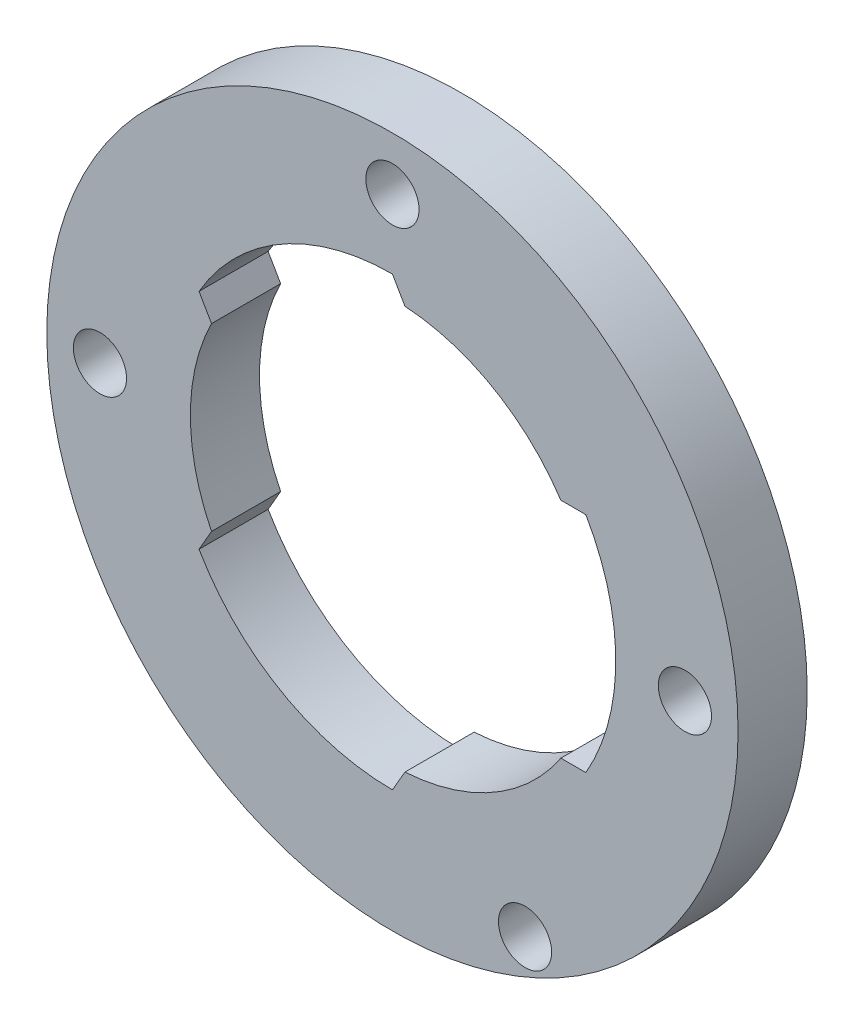
ISO-10303-21;
HEADER;
FILE_DESCRIPTION(('STEP AP214'),'2;1');
FILE_NAME('part.step','',(''),(''),'','','');
FILE_SCHEMA(('AUTOMOTIVE_DESIGN { 1 0 10303 214 1 1 1 1 }'));
ENDSEC;
DATA;
#1=APPLICATION_CONTEXT('core data for automotive mechanical design processes');
#2=APPLICATION_PROTOCOL_DEFINITION('international standard','automotive_design',2000,#1);
#3=PRODUCT_CONTEXT('',#1,'mechanical');
#4=PRODUCT('Part','Part','',(#3));
#5=PRODUCT_RELATED_PRODUCT_CATEGORY('part','',(#4));
#6=PRODUCT_DEFINITION_FORMATION('','',#4);
#7=PRODUCT_DEFINITION_CONTEXT('part definition',#1,'design');
#8=PRODUCT_DEFINITION('design','',#6,#7);
#9=PRODUCT_DEFINITION_SHAPE('','',#8);
#10=(LENGTH_UNIT() NAMED_UNIT(*) SI_UNIT(.MILLI.,.METRE.));
#11=(NAMED_UNIT(*) PLANE_ANGLE_UNIT() SI_UNIT($,.RADIAN.));
#12=(NAMED_UNIT(*) SI_UNIT($,.STERADIAN.) SOLID_ANGLE_UNIT());
#13=UNCERTAINTY_MEASURE_WITH_UNIT(LENGTH_MEASURE(1.E-05),#10,'distance_accuracy_value','');
#14=(GEOMETRIC_REPRESENTATION_CONTEXT(3) GLOBAL_UNCERTAINTY_ASSIGNED_CONTEXT((#13)) GLOBAL_UNIT_ASSIGNED_CONTEXT((#10,
#11,#12)) REPRESENTATION_CONTEXT('',''));
#15=CARTESIAN_POINT('',(0.,0.,0.));
#16=DIRECTION('',(0.,0.,1.));
#17=DIRECTION('',(1.,0.,0.));
#18=AXIS2_PLACEMENT_3D('',#15,#16,#17);
#19=CARTESIAN_POINT('',(-34.925,1.15524367340063E-13,4.1275));
#20=DIRECTION('',(0.,0.,1.));
#21=DIRECTION('',(1.,0.,0.));
#22=AXIS2_PLACEMENT_3D('',#19,#20,#21);
#23=CYLINDRICAL_SURFACE('',#22,1.7);
#24=CARTESIAN_POINT('',(-34.925,1.15524367340063E-13,-4.1275));
#25=DIRECTION('',(0.,0.,1.));
#26=DIRECTION('',(1.,0.,0.));
#27=AXIS2_PLACEMENT_3D('',#24,#25,#26);
#28=CIRCLE('',#27,1.7);
#29=CARTESIAN_POINT('',(-33.225,1.15524367340063E-13,-4.1275));
#30=VERTEX_POINT('',#29);
#31=EDGE_CURVE('E204',#30,#30,#28,.T.);
#32=ORIENTED_EDGE('',*,*,#31,.F.);
#33=EDGE_LOOP('',(#32));
#34=FACE_BOUND('',#33,.T.);
#35=CARTESIAN_POINT('',(-34.925,1.15524367340063E-13,-1.872499906));
#36=DIRECTION('',(0.,0.,1.));
#37=DIRECTION('',(1.,0.,0.));
#38=AXIS2_PLACEMENT_3D('',#35,#36,#37);
#39=CIRCLE('',#38,1.7);
#40=CARTESIAN_POINT('',(-33.225,1.15524367340063E-13,-1.872499906));
#41=VERTEX_POINT('',#40);
#42=EDGE_CURVE('E39',#41,#41,#39,.F.);
#43=ORIENTED_EDGE('',*,*,#42,.F.);
#44=EDGE_LOOP('',(#43));
#45=FACE_BOUND('',#44,.T.);
#46=ADVANCED_FACE('F35',(#34,#45),#23,.F.);
#47=CARTESIAN_POINT('',(34.925,-1.28355604178129E-13,4.1275));
#48=DIRECTION('',(0.,0.,1.));
#49=DIRECTION('',(1.,0.,0.));
#50=AXIS2_PLACEMENT_3D('',#47,#48,#49);
#51=CYLINDRICAL_SURFACE('',#50,1.7);
#52=CARTESIAN_POINT('',(34.925,-1.28355604178129E-13,-4.1275));
#53=DIRECTION('',(0.,0.,1.));
#54=DIRECTION('',(1.,0.,0.));
#55=AXIS2_PLACEMENT_3D('',#52,#53,#54);
#56=CIRCLE('',#55,1.7);
#57=CARTESIAN_POINT('',(36.625,-1.28355604178129E-13,-4.1275));
#58=VERTEX_POINT('',#57);
#59=EDGE_CURVE('E201',#58,#58,#56,.T.);
#60=ORIENTED_EDGE('',*,*,#59,.F.);
#61=EDGE_LOOP('',(#60));
#62=FACE_BOUND('',#61,.T.);
#63=CARTESIAN_POINT('',(34.925,-1.28355604178129E-13,-1.872499906));
#64=DIRECTION('',(0.,0.,1.));
#65=DIRECTION('',(1.,0.,0.));
#66=AXIS2_PLACEMENT_3D('',#63,#64,#65);
#67=CIRCLE('',#66,1.7);
#68=CARTESIAN_POINT('',(36.625,-1.28355604178129E-13,-1.872499906));
#69=VERTEX_POINT('',#68);
#70=EDGE_CURVE('E238',#69,#69,#67,.F.);
#71=ORIENTED_EDGE('',*,*,#70,.F.);
#72=EDGE_LOOP('',(#71));
#73=FACE_BOUND('',#72,.T.);
#74=ADVANCED_FACE('F277',(#62,#73),#51,.F.);
#75=CARTESIAN_POINT('',(1.21939985759096E-13,34.925,4.1275));
#76=DIRECTION('',(0.,0.,1.));
#77=DIRECTION('',(1.,0.,0.));
#78=AXIS2_PLACEMENT_3D('',#75,#76,#77);
#79=CYLINDRICAL_SURFACE('',#78,1.7);
#80=CARTESIAN_POINT('',(1.21939985759096E-13,34.925,-4.1275));
#81=DIRECTION('',(0.,0.,1.));
#82=DIRECTION('',(1.,0.,0.));
#83=AXIS2_PLACEMENT_3D('',#80,#81,#82);
#84=CIRCLE('',#83,1.7);
#85=CARTESIAN_POINT('',(1.70000000000012,34.925,-4.1275));
#86=VERTEX_POINT('',#85);
#87=EDGE_CURVE('E196',#86,#86,#84,.T.);
#88=ORIENTED_EDGE('',*,*,#87,.F.);
#89=EDGE_LOOP('',(#88));
#90=FACE_BOUND('',#89,.T.);
#91=CARTESIAN_POINT('',(1.21939985759096E-13,34.925,-1.872499906));
#92=DIRECTION('',(0.,0.,1.));
#93=DIRECTION('',(1.,0.,0.));
#94=AXIS2_PLACEMENT_3D('',#91,#92,#93);
#95=CIRCLE('',#94,1.7);
#96=CARTESIAN_POINT('',(1.70000000000012,34.925,-1.872499906));
#97=VERTEX_POINT('',#96);
#98=EDGE_CURVE('E235',#97,#97,#95,.F.);
#99=ORIENTED_EDGE('',*,*,#98,.F.);
#100=EDGE_LOOP('',(#99));
#101=FACE_BOUND('',#100,.T.);
#102=ADVANCED_FACE('F255',(#90,#101),#79,.F.);
#103=CARTESIAN_POINT('',(15.8333931761151,-33.9548212413282,4.1275));
#104=DIRECTION('',(0.,0.,1.));
#105=DIRECTION('',(1.,0.,0.));
#106=AXIS2_PLACEMENT_3D('',#103,#104,#105);
#107=CYLINDRICAL_SURFACE('',#106,1.7);
#108=CARTESIAN_POINT('',(15.8333931761151,-33.9548212413282,-4.1275));
#109=DIRECTION('',(0.,0.,1.));
#110=DIRECTION('',(1.,0.,0.));
#111=AXIS2_PLACEMENT_3D('',#108,#109,#110);
#112=CIRCLE('',#111,1.7);
#113=CARTESIAN_POINT('',(17.5333931761151,-33.9548212413282,-4.1275));
#114=VERTEX_POINT('',#113);
#115=EDGE_CURVE('E152',#114,#114,#112,.T.);
#116=ORIENTED_EDGE('',*,*,#115,.F.);
#117=EDGE_LOOP('',(#116));
#118=FACE_BOUND('',#117,.T.);
#119=CARTESIAN_POINT('',(15.8333931761151,-33.9548212413282,-1.872499906));
#120=DIRECTION('',(0.,0.,1.));
#121=DIRECTION('',(1.,0.,0.));
#122=AXIS2_PLACEMENT_3D('',#119,#120,#121);
#123=CIRCLE('',#122,1.7);
#124=CARTESIAN_POINT('',(17.5333931761151,-33.9548212413282,-1.872499906));
#125=VERTEX_POINT('',#124);
#126=EDGE_CURVE('E232',#125,#125,#123,.F.);
#127=ORIENTED_EDGE('',*,*,#126,.F.);
#128=EDGE_LOOP('',(#127));
#129=FACE_BOUND('',#128,.T.);
#130=ADVANCED_FACE('F251',(#118,#129),#107,.F.);
#131=CARTESIAN_POINT('',(0.,0.,4.1275));
#132=DIRECTION('',(0.,0.,-1.));
#133=DIRECTION('',(-1.,0.,0.));
#134=AXIS2_PLACEMENT_3D('',#131,#132,#133);
#135=CYLINDRICAL_SURFACE('',#134,24.13);
#136=DIRECTION('',(0.,0.,-1.));
#137=VECTOR('',#136,1.);
#138=CARTESIAN_POINT('',(1.49316811942358,24.0837569529161,4.1275));
#139=LINE('',#138,#137);
#140=CARTESIAN_POINT('',(1.49316811942358,24.0837569529161,-4.1275));
#141=VERTEX_POINT('',#140);
#142=CARTESIAN_POINT('',(1.49316811942358,24.0837569529161,4.1275));
#143=VERTEX_POINT('',#142);
#144=EDGE_CURVE('E11',#141,#143,#139,.F.);
#145=ORIENTED_EDGE('',*,*,#144,.F.);
#146=CARTESIAN_POINT('',(0.,0.,-4.1275));
#147=DIRECTION('',(0.,0.,1.));
#148=DIRECTION('',(1.,0.,0.));
#149=AXIS2_PLACEMENT_3D('',#146,#147,#148);
#150=CIRCLE('',#149,24.13);
#151=CARTESIAN_POINT('',(20.1105612800836,13.335,-4.1275));
#152=VERTEX_POINT('',#151);
#153=EDGE_CURVE('E213',#152,#141,#150,.T.);
#154=ORIENTED_EDGE('',*,*,#153,.F.);
#155=DIRECTION('',(0.,0.,-1.));
#156=VECTOR('',#155,1.);
#157=CARTESIAN_POINT('',(20.1105612800836,13.335,4.1275));
#158=LINE('',#157,#156);
#159=CARTESIAN_POINT('',(20.1105612800836,13.335,4.1275));
#160=VERTEX_POINT('',#159);
#161=EDGE_CURVE('E220',#160,#152,#158,.T.);
#162=ORIENTED_EDGE('',*,*,#161,.F.);
#163=CARTESIAN_POINT('',(0.,0.,4.1275));
#164=DIRECTION('',(0.,0.,1.));
#165=DIRECTION('',(1.,0.,0.));
#166=AXIS2_PLACEMENT_3D('',#163,#164,#165);
#167=CIRCLE('',#166,24.13);
#168=EDGE_CURVE('E208',#160,#143,#167,.T.);
#169=ORIENTED_EDGE('',*,*,#168,.T.);
#170=EDGE_LOOP('',(#145,#154,#162,#169));
#171=FACE_BOUND('',#170,.T.);
#172=ADVANCED_FACE('F254',(#171),#135,.F.);
#173=DIRECTION('',(0.,0.,-1.));
#174=VECTOR('',#173,1.);
#175=CARTESIAN_POINT('',(-21.6037293995074,10.748756952916,4.1275));
#176=LINE('',#175,#174);
#177=CARTESIAN_POINT('',(-21.6037293995074,10.748756952916,4.1275));
#178=VERTEX_POINT('',#177);
#179=CARTESIAN_POINT('',(-21.6037293995074,10.748756952916,-4.1275));
#180=VERTEX_POINT('',#179);
#181=EDGE_CURVE('E44',#178,#180,#176,.T.);
#182=ORIENTED_EDGE('',*,*,#181,.F.);
#183=CARTESIAN_POINT('',(-21.6037293995072,-10.7487569529163,4.1275));
#184=VERTEX_POINT('',#183);
#185=EDGE_CURVE('E212',#178,#184,#167,.T.);
#186=ORIENTED_EDGE('',*,*,#185,.T.);
#187=DIRECTION('',(0.,0.,-1.));
#188=VECTOR('',#187,1.);
#189=CARTESIAN_POINT('',(-21.6037293995072,-10.7487569529163,4.1275));
#190=LINE('',#189,#188);
#191=CARTESIAN_POINT('',(-21.6037293995072,-10.7487569529163,-4.1275));
#192=VERTEX_POINT('',#191);
#193=EDGE_CURVE('E229',#192,#184,#190,.F.);
#194=ORIENTED_EDGE('',*,*,#193,.F.);
#195=EDGE_CURVE('E216',#180,#192,#150,.T.);
#196=ORIENTED_EDGE('',*,*,#195,.F.);
#197=EDGE_LOOP('',(#182,#186,#194,#196));
#198=FACE_BOUND('',#197,.T.);
#199=ADVANCED_FACE('F294',(#198),#135,.F.);
#200=CARTESIAN_POINT('',(0.,0.,4.1275));
#201=DIRECTION('',(0.,0.,1.));
#202=DIRECTION('',(1.,0.,0.));
#203=AXIS2_PLACEMENT_3D('',#200,#201,#202);
#204=PLANE('',#203);
#205=CARTESIAN_POINT('',(1.21939985759096E-13,34.925,4.1275));
#206=DIRECTION('',(0.,0.,1.));
#207=DIRECTION('',(1.,0.,0.));
#208=AXIS2_PLACEMENT_3D('',#205,#206,#207);
#209=CIRCLE('',#208,3.175);
#210=CARTESIAN_POINT('',(3.17500000000012,34.925,4.1275));
#211=VERTEX_POINT('',#210);
#212=EDGE_CURVE('E403',#211,#211,#209,.T.);
#213=ORIENTED_EDGE('',*,*,#212,.F.);
#214=EDGE_LOOP('',(#213));
#215=FACE_BOUND('',#214,.T.);
#216=CARTESIAN_POINT('',(34.925,-1.28355604178129E-13,4.1275));
#217=DIRECTION('',(0.,0.,1.));
#218=DIRECTION('',(1.,0.,0.));
#219=AXIS2_PLACEMENT_3D('',#216,#217,#218);
#220=CIRCLE('',#219,3.175);
#221=CARTESIAN_POINT('',(38.1,-1.28355604178129E-13,4.1275));
#222=VERTEX_POINT('',#221);
#223=EDGE_CURVE('E399',#222,#222,#220,.T.);
#224=ORIENTED_EDGE('',*,*,#223,.F.);
#225=EDGE_LOOP('',(#224));
#226=FACE_BOUND('',#225,.T.);
#227=CARTESIAN_POINT('',(15.8333931761151,-33.9548212413282,4.1275));
#228=DIRECTION('',(0.,0.,1.));
#229=DIRECTION('',(1.,0.,0.));
#230=AXIS2_PLACEMENT_3D('',#227,#228,#229);
#231=CIRCLE('',#230,3.175);
#232=CARTESIAN_POINT('',(19.0083931761151,-33.9548212413282,4.1275));
#233=VERTEX_POINT('',#232);
#234=EDGE_CURVE('E405',#233,#233,#231,.T.);
#235=ORIENTED_EDGE('',*,*,#234,.F.);
#236=EDGE_LOOP('',(#235));
#237=FACE_BOUND('',#236,.T.);
#238=CARTESIAN_POINT('',(-34.925,1.15524367340063E-13,4.1275));
#239=DIRECTION('',(0.,0.,1.));
#240=DIRECTION('',(1.,0.,0.));
#241=AXIS2_PLACEMENT_3D('',#238,#239,#240);
#242=CIRCLE('',#241,3.175);
#243=CARTESIAN_POINT('',(-31.75,1.15524367340063E-13,4.1275));
#244=VERTEX_POINT('',#243);
#245=EDGE_CURVE('E413',#244,#244,#242,.T.);
#246=ORIENTED_EDGE('',*,*,#245,.F.);
#247=EDGE_LOOP('',(#246));
#248=FACE_BOUND('',#247,.T.);
#249=DIRECTION('',(0.500000000000004,-0.866025403784437,0.));
#250=VECTOR('',#249,1.);
#251=CARTESIAN_POINT('',(11.5484487594655,6.66750000000006,4.1275));
#252=LINE('',#251,#250);
#253=CARTESIAN_POINT('',(-1.05818132034585E-13,26.67,4.1275));
#254=VERTEX_POINT('',#253);
#255=EDGE_CURVE('E165',#254,#143,#252,.T.);
#256=ORIENTED_EDGE('',*,*,#255,.T.);
#257=ORIENTED_EDGE('',*,*,#168,.F.);
#258=DIRECTION('',(1.,0.,0.));
#259=VECTOR('',#258,1.);
#260=CARTESIAN_POINT('',(23.096897518931,13.335,4.1275));
#261=LINE('',#260,#259);
#262=CARTESIAN_POINT('',(23.096897518931,13.335,4.1275));
#263=VERTEX_POINT('',#262);
#264=EDGE_CURVE('E178',#160,#263,#261,.T.);
#265=ORIENTED_EDGE('',*,*,#264,.T.);
#266=CARTESIAN_POINT('',(0.,0.,4.1275));
#267=DIRECTION('',(0.,0.,-1.));
#268=DIRECTION('',(-1.,0.,0.));
#269=AXIS2_PLACEMENT_3D('',#266,#267,#268);
#270=CIRCLE('',#269,26.67);
#271=CARTESIAN_POINT('',(23.096897518931,-13.335,4.1275));
#272=VERTEX_POINT('',#271);
#273=EDGE_CURVE('E181',#263,#272,#270,.T.);
#274=ORIENTED_EDGE('',*,*,#273,.T.);
#275=DIRECTION('',(-1.,0.,0.));
#276=VECTOR('',#275,1.);
#277=CARTESIAN_POINT('',(0.,-13.335,4.1275));
#278=LINE('',#277,#276);
#279=CARTESIAN_POINT('',(20.1105612800836,-13.335,4.1275));
#280=VERTEX_POINT('',#279);
#281=EDGE_CURVE('E185',#272,#280,#278,.T.);
#282=ORIENTED_EDGE('',*,*,#281,.T.);
#283=CARTESIAN_POINT('',(1.49316811942391,-24.0837569529161,4.1275));
#284=VERTEX_POINT('',#283);
#285=EDGE_CURVE('E146',#284,#280,#167,.T.);
#286=ORIENTED_EDGE('',*,*,#285,.F.);
#287=DIRECTION('',(-0.499999999999992,-0.866025403784443,0.));
#288=VECTOR('',#287,1.);
#289=CARTESIAN_POINT('',(2.67147415300428E-13,-26.67,4.1275));
#290=LINE('',#289,#288);
#291=CARTESIAN_POINT('',(2.67147415300428E-13,-26.67,4.1275));
#292=VERTEX_POINT('',#291);
#293=EDGE_CURVE('E52',#284,#292,#290,.T.);
#294=ORIENTED_EDGE('',*,*,#293,.T.);
#295=CARTESIAN_POINT('',(0.,0.,4.1275));
#296=DIRECTION('',(0.,0.,-1.));
#297=DIRECTION('',(0.499999999999992,0.866025403784443,0.));
#298=AXIS2_PLACEMENT_3D('',#295,#296,#297);
#299=CIRCLE('',#298,26.67);
#300=CARTESIAN_POINT('',(-23.0968975189309,-13.3350000000002,4.1275));
#301=VERTEX_POINT('',#300);
#302=EDGE_CURVE('E135',#292,#301,#299,.T.);
#303=ORIENTED_EDGE('',*,*,#302,.T.);
#304=DIRECTION('',(0.499999999999992,0.866025403784443,0.));
#305=VECTOR('',#304,1.);
#306=CARTESIAN_POINT('',(-11.5484487594656,6.6674999999999,4.1275));
#307=LINE('',#306,#305);
#308=EDGE_CURVE('E132',#301,#184,#307,.T.);
#309=ORIENTED_EDGE('',*,*,#308,.T.);
#310=ORIENTED_EDGE('',*,*,#185,.F.);
#311=DIRECTION('',(-0.500000000000004,0.866025403784436,0.));
#312=VECTOR('',#311,1.);
#313=CARTESIAN_POINT('',(-23.0968975189311,13.3349999999999,4.1275));
#314=LINE('',#313,#312);
#315=CARTESIAN_POINT('',(-23.0968975189311,13.3349999999999,4.1275));
#316=VERTEX_POINT('',#315);
#317=EDGE_CURVE('E60',#178,#316,#314,.T.);
#318=ORIENTED_EDGE('',*,*,#317,.T.);
#319=CARTESIAN_POINT('',(0.,0.,4.1275));
#320=DIRECTION('',(0.,0.,-1.));
#321=DIRECTION('',(0.500000000000004,-0.866025403784436,0.));
#322=AXIS2_PLACEMENT_3D('',#319,#320,#321);
#323=CIRCLE('',#322,26.67);
#324=EDGE_CURVE('E161',#316,#254,#323,.T.);
#325=ORIENTED_EDGE('',*,*,#324,.T.);
#326=EDGE_LOOP('',(#256,#257,#265,#274,#282,#286,#294,#303,#309,#310,#318,#325));
#327=FACE_BOUND('',#326,.T.);
#328=CARTESIAN_POINT('',(0.,0.,4.1275));
#329=DIRECTION('',(0.,0.,1.));
#330=DIRECTION('',(1.,0.,0.));
#331=AXIS2_PLACEMENT_3D('',#328,#329,#330);
#332=CIRCLE('',#331,41.275);
#333=CARTESIAN_POINT('',(41.275,0.,4.1275));
#334=VERTEX_POINT('',#333);
#335=EDGE_CURVE('E217',#334,#334,#332,.T.);
#336=ORIENTED_EDGE('',*,*,#335,.T.);
#337=EDGE_LOOP('',(#336));
#338=FACE_BOUND('',#337,.T.);
#339=ADVANCED_FACE('F143',(#215,#226,#237,#248,#327,#338),#204,.T.);
#340=CARTESIAN_POINT('',(0.,0.,-4.1275));
#341=DIRECTION('',(0.,0.,1.));
#342=DIRECTION('',(1.,0.,0.));
#343=AXIS2_PLACEMENT_3D('',#340,#341,#342);
#344=PLANE('',#343);
#345=ORIENTED_EDGE('',*,*,#115,.T.);
#346=EDGE_LOOP('',(#345));
#347=FACE_BOUND('',#346,.T.);
#348=ORIENTED_EDGE('',*,*,#87,.T.);
#349=EDGE_LOOP('',(#348));
#350=FACE_BOUND('',#349,.T.);
#351=ORIENTED_EDGE('',*,*,#59,.T.);
#352=EDGE_LOOP('',(#351));
#353=FACE_BOUND('',#352,.T.);
#354=ORIENTED_EDGE('',*,*,#31,.T.);
#355=EDGE_LOOP('',(#354));
#356=FACE_BOUND('',#355,.T.);
#357=CARTESIAN_POINT('',(0.,0.,-4.1275));
#358=DIRECTION('',(0.,0.,1.));
#359=DIRECTION('',(1.,0.,0.));
#360=AXIS2_PLACEMENT_3D('',#357,#358,#359);
#361=CIRCLE('',#360,41.275);
#362=CARTESIAN_POINT('',(41.275,0.,-4.1275));
#363=VERTEX_POINT('',#362);
#364=EDGE_CURVE('E211',#363,#363,#361,.T.);
#365=ORIENTED_EDGE('',*,*,#364,.F.);
#366=EDGE_LOOP('',(#365));
#367=FACE_BOUND('',#366,.T.);
#368=ORIENTED_EDGE('',*,*,#153,.T.);
#369=DIRECTION('',(0.500000000000004,-0.866025403784437,0.));
#370=VECTOR('',#369,1.);
#371=CARTESIAN_POINT('',(11.5484487594655,6.66750000000006,-4.1275));
#372=LINE('',#371,#370);
#373=CARTESIAN_POINT('',(-1.05818132034585E-13,26.67,-4.1275));
#374=VERTEX_POINT('',#373);
#375=EDGE_CURVE('E162',#374,#141,#372,.T.);
#376=ORIENTED_EDGE('',*,*,#375,.F.);
#377=CARTESIAN_POINT('',(0.,0.,-4.1275));
#378=DIRECTION('',(0.,0.,-1.));
#379=DIRECTION('',(0.500000000000004,-0.866025403784436,0.));
#380=AXIS2_PLACEMENT_3D('',#377,#378,#379);
#381=CIRCLE('',#380,26.67);
#382=CARTESIAN_POINT('',(-23.0968975189311,13.3349999999999,-4.1275));
#383=VERTEX_POINT('',#382);
#384=EDGE_CURVE('E169',#383,#374,#381,.T.);
#385=ORIENTED_EDGE('',*,*,#384,.F.);
#386=DIRECTION('',(-0.500000000000004,0.866025403784436,0.));
#387=VECTOR('',#386,1.);
#388=CARTESIAN_POINT('',(-23.0968975189311,13.3349999999999,-4.1275));
#389=LINE('',#388,#387);
#390=EDGE_CURVE('E158',#180,#383,#389,.T.);
#391=ORIENTED_EDGE('',*,*,#390,.F.);
#392=ORIENTED_EDGE('',*,*,#195,.T.);
#393=DIRECTION('',(0.499999999999992,0.866025403784443,0.));
#394=VECTOR('',#393,1.);
#395=CARTESIAN_POINT('',(-11.5484487594656,6.6674999999999,-4.1275));
#396=LINE('',#395,#394);
#397=CARTESIAN_POINT('',(-23.0968975189309,-13.3350000000002,-4.1275));
#398=VERTEX_POINT('',#397);
#399=EDGE_CURVE('E147',#398,#192,#396,.T.);
#400=ORIENTED_EDGE('',*,*,#399,.F.);
#401=CARTESIAN_POINT('',(0.,0.,-4.1275));
#402=DIRECTION('',(0.,0.,-1.));
#403=DIRECTION('',(0.499999999999992,0.866025403784443,0.));
#404=AXIS2_PLACEMENT_3D('',#401,#402,#403);
#405=CIRCLE('',#404,26.67);
#406=CARTESIAN_POINT('',(2.67147415300428E-13,-26.67,-4.1275));
#407=VERTEX_POINT('',#406);
#408=EDGE_CURVE('E149',#407,#398,#405,.T.);
#409=ORIENTED_EDGE('',*,*,#408,.F.);
#410=DIRECTION('',(-0.499999999999992,-0.866025403784443,0.));
#411=VECTOR('',#410,1.);
#412=CARTESIAN_POINT('',(2.67147415300428E-13,-26.67,-4.1275));
#413=LINE('',#412,#411);
#414=CARTESIAN_POINT('',(1.49316811942391,-24.0837569529161,-4.1275));
#415=VERTEX_POINT('',#414);
#416=EDGE_CURVE('E127',#415,#407,#413,.T.);
#417=ORIENTED_EDGE('',*,*,#416,.F.);
#418=CARTESIAN_POINT('',(20.1105612800836,-13.335,-4.1275));
#419=VERTEX_POINT('',#418);
#420=EDGE_CURVE('E207',#415,#419,#150,.T.);
#421=ORIENTED_EDGE('',*,*,#420,.T.);
#422=DIRECTION('',(-1.,0.,0.));
#423=VECTOR('',#422,1.);
#424=CARTESIAN_POINT('',(0.,-13.335,-4.1275));
#425=LINE('',#424,#423);
#426=CARTESIAN_POINT('',(23.096897518931,-13.335,-4.1275));
#427=VERTEX_POINT('',#426);
#428=EDGE_CURVE('E182',#427,#419,#425,.T.);
#429=ORIENTED_EDGE('',*,*,#428,.F.);
#430=CARTESIAN_POINT('',(0.,0.,-4.1275));
#431=DIRECTION('',(0.,0.,-1.));
#432=DIRECTION('',(-1.,0.,0.));
#433=AXIS2_PLACEMENT_3D('',#430,#431,#432);
#434=CIRCLE('',#433,26.67);
#435=CARTESIAN_POINT('',(23.096897518931,13.335,-4.1275));
#436=VERTEX_POINT('',#435);
#437=EDGE_CURVE('E189',#436,#427,#434,.T.);
#438=ORIENTED_EDGE('',*,*,#437,.F.);
#439=DIRECTION('',(1.,0.,0.));
#440=VECTOR('',#439,1.);
#441=CARTESIAN_POINT('',(23.096897518931,13.335,-4.1275));
#442=LINE('',#441,#440);
#443=EDGE_CURVE('E175',#152,#436,#442,.T.);
#444=ORIENTED_EDGE('',*,*,#443,.F.);
#445=EDGE_LOOP('',(#368,#376,#385,#391,#392,#400,#409,#417,#421,#429,#438,#444));
#446=FACE_BOUND('',#445,.T.);
#447=ADVANCED_FACE('F248',(#347,#350,#353,#356,#367,#446),#344,.F.);
#448=CARTESIAN_POINT('',(0.,0.,4.1275));
#449=DIRECTION('',(0.,0.,-1.));
#450=DIRECTION('',(-1.,0.,0.));
#451=AXIS2_PLACEMENT_3D('',#448,#449,#450);
#452=CYLINDRICAL_SURFACE('',#451,41.275);
#453=ORIENTED_EDGE('',*,*,#335,.F.);
#454=EDGE_LOOP('',(#453));
#455=FACE_BOUND('',#454,.T.);
#456=ORIENTED_EDGE('',*,*,#364,.T.);
#457=EDGE_LOOP('',(#456));
#458=FACE_BOUND('',#457,.T.);
#459=ADVANCED_FACE('F37',(#455,#458),#452,.T.);
#460=DIRECTION('',(0.,0.,-1.));
#461=VECTOR('',#460,1.);
#462=CARTESIAN_POINT('',(1.49316811942391,-24.0837569529161,4.1275));
#463=LINE('',#462,#461);
#464=EDGE_CURVE('E227',#284,#415,#463,.T.);
#465=ORIENTED_EDGE('',*,*,#464,.F.);
#466=ORIENTED_EDGE('',*,*,#285,.T.);
#467=DIRECTION('',(0.,0.,-1.));
#468=VECTOR('',#467,1.);
#469=CARTESIAN_POINT('',(20.1105612800836,-13.335,4.1275));
#470=LINE('',#469,#468);
#471=EDGE_CURVE('E224',#419,#280,#470,.F.);
#472=ORIENTED_EDGE('',*,*,#471,.F.);
#473=ORIENTED_EDGE('',*,*,#420,.F.);
#474=EDGE_LOOP('',(#465,#466,#472,#473));
#475=FACE_BOUND('',#474,.T.);
#476=ADVANCED_FACE('F289',(#475),#135,.F.);
#477=CARTESIAN_POINT('',(0.,-13.335,4.1275));
#478=DIRECTION('',(0.,-1.,0.));
#479=DIRECTION('',(1.,0.,0.));
#480=AXIS2_PLACEMENT_3D('',#477,#478,#479);
#481=PLANE('',#480);
#482=ORIENTED_EDGE('',*,*,#471,.T.);
#483=ORIENTED_EDGE('',*,*,#281,.F.);
#484=DIRECTION('',(0.,0.,-1.));
#485=VECTOR('',#484,1.);
#486=CARTESIAN_POINT('',(23.096897518931,-13.335,4.1275));
#487=LINE('',#486,#485);
#488=EDGE_CURVE('E194',#272,#427,#487,.T.);
#489=ORIENTED_EDGE('',*,*,#488,.T.);
#490=ORIENTED_EDGE('',*,*,#428,.T.);
#491=EDGE_LOOP('',(#482,#483,#489,#490));
#492=FACE_BOUND('',#491,.T.);
#493=ADVANCED_FACE('F292',(#492),#481,.F.);
#494=CARTESIAN_POINT('',(0.,0.,4.1275));
#495=DIRECTION('',(0.,0.,-1.));
#496=DIRECTION('',(-1.,0.,0.));
#497=AXIS2_PLACEMENT_3D('',#494,#495,#496);
#498=CYLINDRICAL_SURFACE('',#497,26.67);
#499=ORIENTED_EDGE('',*,*,#437,.T.);
#500=ORIENTED_EDGE('',*,*,#488,.F.);
#501=ORIENTED_EDGE('',*,*,#273,.F.);
#502=DIRECTION('',(0.,0.,-1.));
#503=VECTOR('',#502,1.);
#504=CARTESIAN_POINT('',(23.096897518931,13.335,4.1275));
#505=LINE('',#504,#503);
#506=EDGE_CURVE('E187',#263,#436,#505,.T.);
#507=ORIENTED_EDGE('',*,*,#506,.T.);
#508=EDGE_LOOP('',(#499,#500,#501,#507));
#509=FACE_BOUND('',#508,.T.);
#510=ADVANCED_FACE('F346',(#509),#498,.F.);
#511=CARTESIAN_POINT('',(23.096897518931,13.335,4.1275));
#512=DIRECTION('',(0.,1.,0.));
#513=DIRECTION('',(0.,0.,1.));
#514=AXIS2_PLACEMENT_3D('',#511,#512,#513);
#515=PLANE('',#514);
#516=ORIENTED_EDGE('',*,*,#161,.T.);
#517=ORIENTED_EDGE('',*,*,#443,.T.);
#518=ORIENTED_EDGE('',*,*,#506,.F.);
#519=ORIENTED_EDGE('',*,*,#264,.F.);
#520=EDGE_LOOP('',(#516,#517,#518,#519));
#521=FACE_BOUND('',#520,.T.);
#522=ADVANCED_FACE('F339',(#521),#515,.F.);
#523=CARTESIAN_POINT('',(-11.5484487594656,6.6674999999999,4.1275));
#524=DIRECTION('',(-0.866025403784443,0.499999999999992,0.));
#525=DIRECTION('',(-0.499999999999992,-0.866025403784443,0.));
#526=AXIS2_PLACEMENT_3D('',#523,#524,#525);
#527=PLANE('',#526);
#528=ORIENTED_EDGE('',*,*,#193,.T.);
#529=ORIENTED_EDGE('',*,*,#308,.F.);
#530=DIRECTION('',(0.,0.,-1.));
#531=VECTOR('',#530,1.);
#532=CARTESIAN_POINT('',(-23.0968975189309,-13.3350000000002,4.1275));
#533=LINE('',#532,#531);
#534=EDGE_CURVE('E131',#301,#398,#533,.T.);
#535=ORIENTED_EDGE('',*,*,#534,.T.);
#536=ORIENTED_EDGE('',*,*,#399,.T.);
#537=EDGE_LOOP('',(#528,#529,#535,#536));
#538=FACE_BOUND('',#537,.T.);
#539=ADVANCED_FACE('F337',(#538),#527,.F.);
#540=CARTESIAN_POINT('',(2.67147415300428E-13,-26.67,4.1275));
#541=DIRECTION('',(0.866025403784443,-0.499999999999992,0.));
#542=DIRECTION('',(0.499999999999992,0.866025403784443,0.));
#543=AXIS2_PLACEMENT_3D('',#540,#541,#542);
#544=PLANE('',#543);
#545=ORIENTED_EDGE('',*,*,#464,.T.);
#546=ORIENTED_EDGE('',*,*,#416,.T.);
#547=DIRECTION('',(0.,0.,-1.));
#548=VECTOR('',#547,1.);
#549=CARTESIAN_POINT('',(2.67147415300428E-13,-26.67,4.1275));
#550=LINE('',#549,#548);
#551=EDGE_CURVE('E123',#292,#407,#550,.T.);
#552=ORIENTED_EDGE('',*,*,#551,.F.);
#553=ORIENTED_EDGE('',*,*,#293,.F.);
#554=EDGE_LOOP('',(#545,#546,#552,#553));
#555=FACE_BOUND('',#554,.T.);
#556=ADVANCED_FACE('F125',(#555),#544,.F.);
#557=CARTESIAN_POINT('',(0.,0.,4.1275));
#558=DIRECTION('',(0.,0.,-1.));
#559=DIRECTION('',(-1.,0.,0.));
#560=AXIS2_PLACEMENT_3D('',#557,#558,#559);
#561=CYLINDRICAL_SURFACE('',#560,26.67);
#562=ORIENTED_EDGE('',*,*,#408,.T.);
#563=ORIENTED_EDGE('',*,*,#534,.F.);
#564=ORIENTED_EDGE('',*,*,#302,.F.);
#565=ORIENTED_EDGE('',*,*,#551,.T.);
#566=EDGE_LOOP('',(#562,#563,#564,#565));
#567=FACE_BOUND('',#566,.T.);
#568=ADVANCED_FACE('F136',(#567),#561,.F.);
#569=CARTESIAN_POINT('',(11.5484487594655,6.66750000000006,4.1275));
#570=DIRECTION('',(0.866025403784437,0.500000000000004,0.));
#571=DIRECTION('',(-0.500000000000004,0.866025403784437,0.));
#572=AXIS2_PLACEMENT_3D('',#569,#570,#571);
#573=PLANE('',#572);
#574=ORIENTED_EDGE('',*,*,#144,.T.);
#575=ORIENTED_EDGE('',*,*,#255,.F.);
#576=DIRECTION('',(0.,0.,-1.));
#577=VECTOR('',#576,1.);
#578=CARTESIAN_POINT('',(-1.05818132034585E-13,26.67,4.1275));
#579=LINE('',#578,#577);
#580=EDGE_CURVE('E173',#254,#374,#579,.T.);
#581=ORIENTED_EDGE('',*,*,#580,.T.);
#582=ORIENTED_EDGE('',*,*,#375,.T.);
#583=EDGE_LOOP('',(#574,#575,#581,#582));
#584=FACE_BOUND('',#583,.T.);
#585=ADVANCED_FACE('F320',(#584),#573,.F.);
#586=CARTESIAN_POINT('',(0.,0.,4.1275));
#587=DIRECTION('',(0.,0.,-1.));
#588=DIRECTION('',(-1.,0.,0.));
#589=AXIS2_PLACEMENT_3D('',#586,#587,#588);
#590=CYLINDRICAL_SURFACE('',#589,26.67);
#591=ORIENTED_EDGE('',*,*,#384,.T.);
#592=ORIENTED_EDGE('',*,*,#580,.F.);
#593=ORIENTED_EDGE('',*,*,#324,.F.);
#594=DIRECTION('',(0.,0.,-1.));
#595=VECTOR('',#594,1.);
#596=CARTESIAN_POINT('',(-23.0968975189311,13.3349999999999,4.1275));
#597=LINE('',#596,#595);
#598=EDGE_CURVE('E167',#316,#383,#597,.T.);
#599=ORIENTED_EDGE('',*,*,#598,.T.);
#600=EDGE_LOOP('',(#591,#592,#593,#599));
#601=FACE_BOUND('',#600,.T.);
#602=ADVANCED_FACE('F272',(#601),#590,.F.);
#603=CARTESIAN_POINT('',(-23.0968975189311,13.3349999999999,4.1275));
#604=DIRECTION('',(-0.866025403784436,-0.500000000000004,0.));
#605=DIRECTION('',(0.500000000000004,-0.866025403784436,0.));
#606=AXIS2_PLACEMENT_3D('',#603,#604,#605);
#607=PLANE('',#606);
#608=ORIENTED_EDGE('',*,*,#181,.T.);
#609=ORIENTED_EDGE('',*,*,#390,.T.);
#610=ORIENTED_EDGE('',*,*,#598,.F.);
#611=ORIENTED_EDGE('',*,*,#317,.F.);
#612=EDGE_LOOP('',(#608,#609,#610,#611));
#613=FACE_BOUND('',#612,.T.);
#614=ADVANCED_FACE('F262',(#613),#607,.F.);
#615=CARTESIAN_POINT('',(15.8333931761151,-33.9548212413282,-1.872499906));
#616=DIRECTION('',(0.,0.,1.));
#617=DIRECTION('',(1.,0.,0.));
#618=AXIS2_PLACEMENT_3D('',#615,#616,#617);
#619=PLANE('',#618);
#620=CARTESIAN_POINT('',(15.8333931761151,-33.9548212413282,-1.872499906));
#621=DIRECTION('',(0.,0.,1.));
#622=DIRECTION('',(1.,0.,0.));
#623=AXIS2_PLACEMENT_3D('',#620,#621,#622);
#624=CIRCLE('',#623,3.175);
#625=CARTESIAN_POINT('',(19.0083931761151,-33.9548212413282,-1.872499906));
#626=VERTEX_POINT('',#625);
#627=EDGE_CURVE('E401',#626,#626,#624,.T.);
#628=ORIENTED_EDGE('',*,*,#627,.T.);
#629=EDGE_LOOP('',(#628));
#630=FACE_BOUND('',#629,.T.);
#631=ORIENTED_EDGE('',*,*,#126,.T.);
#632=EDGE_LOOP('',(#631));
#633=FACE_BOUND('',#632,.T.);
#634=ADVANCED_FACE('F259',(#630,#633),#619,.T.);
#635=CARTESIAN_POINT('',(15.8333931761151,-33.9548212413282,-1.872499906));
#636=DIRECTION('',(0.,0.,1.));
#637=DIRECTION('',(1.,0.,0.));
#638=AXIS2_PLACEMENT_3D('',#635,#636,#637);
#639=CYLINDRICAL_SURFACE('',#638,3.175);
#640=ORIENTED_EDGE('',*,*,#627,.F.);
#641=EDGE_LOOP('',(#640));
#642=FACE_BOUND('',#641,.T.);
#643=ORIENTED_EDGE('',*,*,#234,.T.);
#644=EDGE_LOOP('',(#643));
#645=FACE_BOUND('',#644,.T.);
#646=ADVANCED_FACE('F261',(#642,#645),#639,.F.);
#647=CARTESIAN_POINT('',(1.21939985759096E-13,34.925,-1.872499906));
#648=DIRECTION('',(0.,0.,1.));
#649=DIRECTION('',(1.,0.,0.));
#650=AXIS2_PLACEMENT_3D('',#647,#648,#649);
#651=PLANE('',#650);
#652=CARTESIAN_POINT('',(1.21939985759096E-13,34.925,-1.872499906));
#653=DIRECTION('',(0.,0.,1.));
#654=DIRECTION('',(1.,0.,0.));
#655=AXIS2_PLACEMENT_3D('',#652,#653,#654);
#656=CIRCLE('',#655,3.175);
#657=CARTESIAN_POINT('',(3.17500000000012,34.925,-1.872499906));
#658=VERTEX_POINT('',#657);
#659=EDGE_CURVE('E236',#658,#658,#656,.T.);
#660=ORIENTED_EDGE('',*,*,#659,.T.);
#661=EDGE_LOOP('',(#660));
#662=FACE_BOUND('',#661,.T.);
#663=ORIENTED_EDGE('',*,*,#98,.T.);
#664=EDGE_LOOP('',(#663));
#665=FACE_BOUND('',#664,.T.);
#666=ADVANCED_FACE('F269',(#662,#665),#651,.T.);
#667=CARTESIAN_POINT('',(1.21939985759096E-13,34.925,-1.872499906));
#668=DIRECTION('',(0.,0.,1.));
#669=DIRECTION('',(1.,0.,0.));
#670=AXIS2_PLACEMENT_3D('',#667,#668,#669);
#671=CYLINDRICAL_SURFACE('',#670,3.175);
#672=ORIENTED_EDGE('',*,*,#659,.F.);
#673=EDGE_LOOP('',(#672));
#674=FACE_BOUND('',#673,.T.);
#675=ORIENTED_EDGE('',*,*,#212,.T.);
#676=EDGE_LOOP('',(#675));
#677=FACE_BOUND('',#676,.T.);
#678=ADVANCED_FACE('F370',(#674,#677),#671,.F.);
#679=CARTESIAN_POINT('',(34.925,-1.28355604178129E-13,-1.872499906));
#680=DIRECTION('',(0.,0.,1.));
#681=DIRECTION('',(1.,0.,0.));
#682=AXIS2_PLACEMENT_3D('',#679,#680,#681);
#683=PLANE('',#682);
#684=CARTESIAN_POINT('',(34.925,-1.28355604178129E-13,-1.872499906));
#685=DIRECTION('',(0.,0.,1.));
#686=DIRECTION('',(1.,0.,0.));
#687=AXIS2_PLACEMENT_3D('',#684,#685,#686);
#688=CIRCLE('',#687,3.175);
#689=CARTESIAN_POINT('',(38.1,-1.28355604178129E-13,-1.872499906));
#690=VERTEX_POINT('',#689);
#691=EDGE_CURVE('E396',#690,#690,#688,.T.);
#692=ORIENTED_EDGE('',*,*,#691,.T.);
#693=EDGE_LOOP('',(#692));
#694=FACE_BOUND('',#693,.T.);
#695=ORIENTED_EDGE('',*,*,#70,.T.);
#696=EDGE_LOOP('',(#695));
#697=FACE_BOUND('',#696,.T.);
#698=ADVANCED_FACE('F376',(#694,#697),#683,.T.);
#699=CARTESIAN_POINT('',(34.925,-1.28355604178129E-13,-1.872499906));
#700=DIRECTION('',(0.,0.,1.));
#701=DIRECTION('',(1.,0.,0.));
#702=AXIS2_PLACEMENT_3D('',#699,#700,#701);
#703=CYLINDRICAL_SURFACE('',#702,3.175);
#704=ORIENTED_EDGE('',*,*,#691,.F.);
#705=EDGE_LOOP('',(#704));
#706=FACE_BOUND('',#705,.T.);
#707=ORIENTED_EDGE('',*,*,#223,.T.);
#708=EDGE_LOOP('',(#707));
#709=FACE_BOUND('',#708,.T.);
#710=ADVANCED_FACE('F382',(#706,#709),#703,.F.);
#711=CARTESIAN_POINT('',(-34.925,1.15524367340063E-13,-1.872499906));
#712=DIRECTION('',(0.,0.,1.));
#713=DIRECTION('',(1.,0.,0.));
#714=AXIS2_PLACEMENT_3D('',#711,#712,#713);
#715=PLANE('',#714);
#716=CARTESIAN_POINT('',(-34.925,1.15524367340063E-13,-1.872499906));
#717=DIRECTION('',(0.,0.,1.));
#718=DIRECTION('',(1.,0.,0.));
#719=AXIS2_PLACEMENT_3D('',#716,#717,#718);
#720=CIRCLE('',#719,3.175);
#721=CARTESIAN_POINT('',(-31.75,1.15524367340063E-13,-1.872499906));
#722=VERTEX_POINT('',#721);
#723=EDGE_CURVE('E411',#722,#722,#720,.T.);
#724=ORIENTED_EDGE('',*,*,#723,.T.);
#725=EDGE_LOOP('',(#724));
#726=FACE_BOUND('',#725,.T.);
#727=ORIENTED_EDGE('',*,*,#42,.T.);
#728=EDGE_LOOP('',(#727));
#729=FACE_BOUND('',#728,.T.);
#730=ADVANCED_FACE('F385',(#726,#729),#715,.T.);
#731=CARTESIAN_POINT('',(-34.925,1.15524367340063E-13,-1.872499906));
#732=DIRECTION('',(0.,0.,1.));
#733=DIRECTION('',(1.,0.,0.));
#734=AXIS2_PLACEMENT_3D('',#731,#732,#733);
#735=CYLINDRICAL_SURFACE('',#734,3.175);
#736=ORIENTED_EDGE('',*,*,#723,.F.);
#737=EDGE_LOOP('',(#736));
#738=FACE_BOUND('',#737,.T.);
#739=ORIENTED_EDGE('',*,*,#245,.T.);
#740=EDGE_LOOP('',(#739));
#741=FACE_BOUND('',#740,.T.);
#742=ADVANCED_FACE('F390',(#738,#741),#735,.F.);
#743=CLOSED_SHELL('',(#46,#74,#102,#130,#172,#199,#339,#447,#459,#476,#493,#510,#522,#539,#556,
#568,#585,#602,#614,#634,#646,#666,#678,#698,#710,#730,#742));
#744=MANIFOLD_SOLID_BREP('B2',#743);
#745=ADVANCED_BREP_SHAPE_REPRESENTATION('',(#18,#744),#14);
#746=SHAPE_DEFINITION_REPRESENTATION(#9,#745);
ENDSEC;
END-ISO-10303-21;
